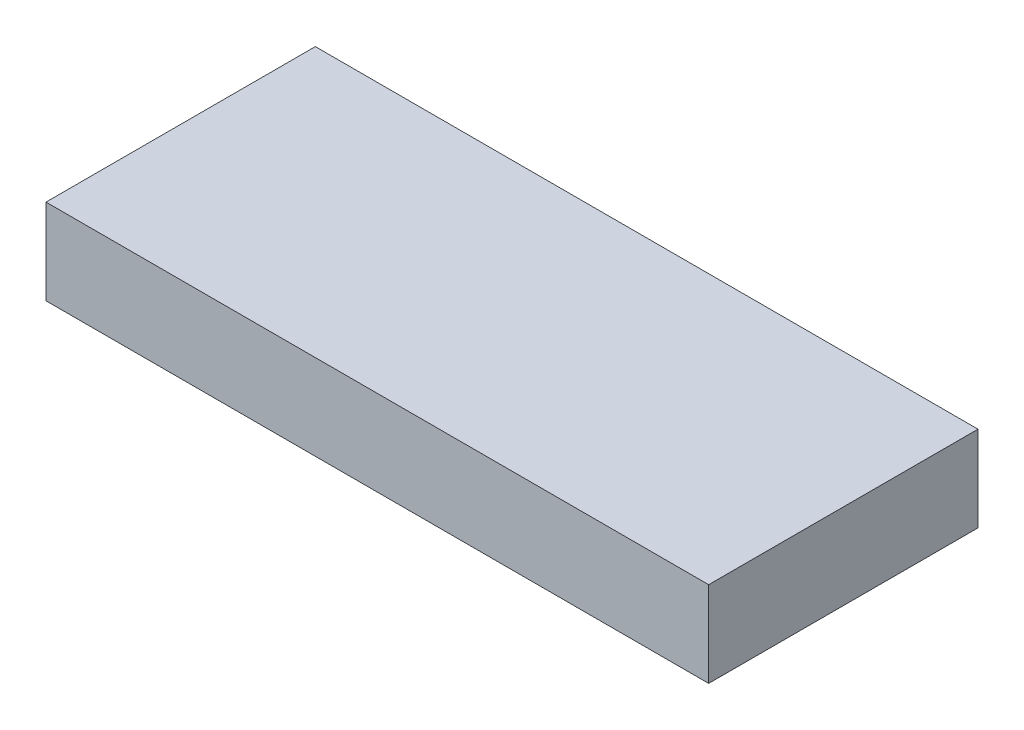
ISO-10303-21;
HEADER;
FILE_DESCRIPTION(('STEP AP214'),'2;1');
FILE_NAME('part.step','',(''),(''),'','','');
FILE_SCHEMA(('AUTOMOTIVE_DESIGN { 1 0 10303 214 1 1 1 1 }'));
ENDSEC;
DATA;
#1=APPLICATION_CONTEXT('core data for automotive mechanical design processes');
#2=APPLICATION_PROTOCOL_DEFINITION('international standard','automotive_design',2000,#1);
#3=PRODUCT_CONTEXT('',#1,'mechanical');
#4=PRODUCT('Part','Part','',(#3));
#5=PRODUCT_RELATED_PRODUCT_CATEGORY('part','',(#4));
#6=PRODUCT_DEFINITION_FORMATION('','',#4);
#7=PRODUCT_DEFINITION_CONTEXT('part definition',#1,'design');
#8=PRODUCT_DEFINITION('design','',#6,#7);
#9=PRODUCT_DEFINITION_SHAPE('','',#8);
#10=(LENGTH_UNIT() NAMED_UNIT(*) SI_UNIT(.MILLI.,.METRE.));
#11=(NAMED_UNIT(*) PLANE_ANGLE_UNIT() SI_UNIT($,.RADIAN.));
#12=(NAMED_UNIT(*) SI_UNIT($,.STERADIAN.) SOLID_ANGLE_UNIT());
#13=UNCERTAINTY_MEASURE_WITH_UNIT(LENGTH_MEASURE(1.E-05),#10,'distance_accuracy_value','');
#14=(GEOMETRIC_REPRESENTATION_CONTEXT(3) GLOBAL_UNCERTAINTY_ASSIGNED_CONTEXT((#13)) GLOBAL_UNIT_ASSIGNED_CONTEXT((#10,
#11,#12)) REPRESENTATION_CONTEXT('',''));
#15=CARTESIAN_POINT('',(0.,0.,0.));
#16=DIRECTION('',(0.,0.,1.));
#17=DIRECTION('',(1.,0.,0.));
#18=AXIS2_PLACEMENT_3D('',#15,#16,#17);
#19=CARTESIAN_POINT('',(-26.9514925373134,16.2518656716418,12.6));
#20=DIRECTION('',(1.,0.,0.));
#21=DIRECTION('',(0.,1.,0.));
#22=AXIS2_PLACEMENT_3D('',#19,#20,#21);
#23=PLANE('',#22);
#24=DIRECTION('',(0.,-1.,0.));
#25=VECTOR('',#24,1.);
#26=CARTESIAN_POINT('',(-26.9514925373134,16.2518656716418,0.));
#27=LINE('',#26,#25);
#28=CARTESIAN_POINT('',(-26.9514925373134,16.2518656716418,0.));
#29=VERTEX_POINT('',#28);
#30=CARTESIAN_POINT('',(-26.9514925373134,12.2518656716418,0.));
#31=VERTEX_POINT('',#30);
#32=EDGE_CURVE('E95',#29,#31,#27,.T.);
#33=ORIENTED_EDGE('',*,*,#32,.T.);
#34=DIRECTION('',(0.,0.,-1.));
#35=VECTOR('',#34,1.);
#36=CARTESIAN_POINT('',(-26.9514925373134,12.2518656716418,12.6));
#37=LINE('',#36,#35);
#38=CARTESIAN_POINT('',(-26.9514925373134,12.2518656716418,12.6));
#39=VERTEX_POINT('',#38);
#40=EDGE_CURVE('E11',#39,#31,#37,.T.);
#41=ORIENTED_EDGE('',*,*,#40,.F.);
#42=DIRECTION('',(0.,-1.,0.));
#43=VECTOR('',#42,1.);
#44=CARTESIAN_POINT('',(-26.9514925373134,16.2518656716418,12.6));
#45=LINE('',#44,#43);
#46=CARTESIAN_POINT('',(-26.9514925373134,16.2518656716418,12.6));
#47=VERTEX_POINT('',#46);
#48=EDGE_CURVE('E83',#47,#39,#45,.T.);
#49=ORIENTED_EDGE('',*,*,#48,.F.);
#50=DIRECTION('',(0.,0.,-1.));
#51=VECTOR('',#50,1.);
#52=CARTESIAN_POINT('',(-26.9514925373134,16.2518656716418,12.6));
#53=LINE('',#52,#51);
#54=EDGE_CURVE('E91',#47,#29,#53,.T.);
#55=ORIENTED_EDGE('',*,*,#54,.T.);
#56=EDGE_LOOP('',(#33,#41,#49,#55));
#57=FACE_BOUND('',#56,.T.);
#58=ADVANCED_FACE('F32',(#57),#23,.F.);
#59=CARTESIAN_POINT('',(-26.9514925373134,12.2518656716418,12.6));
#60=DIRECTION('',(0.,1.,0.));
#61=DIRECTION('',(0.,0.,1.));
#62=AXIS2_PLACEMENT_3D('',#59,#60,#61);
#63=PLANE('',#62);
#64=DIRECTION('',(1.,0.,0.));
#65=VECTOR('',#64,1.);
#66=CARTESIAN_POINT('',(-26.9514925373134,12.2518656716418,0.));
#67=LINE('',#66,#65);
#68=CARTESIAN_POINT('',(4.04850746268657,12.2518656716418,0.));
#69=VERTEX_POINT('',#68);
#70=EDGE_CURVE('E87',#31,#69,#67,.T.);
#71=ORIENTED_EDGE('',*,*,#70,.T.);
#72=DIRECTION('',(0.,0.,-1.));
#73=VECTOR('',#72,1.);
#74=CARTESIAN_POINT('',(4.04850746268657,12.2518656716418,12.6));
#75=LINE('',#74,#73);
#76=CARTESIAN_POINT('',(4.04850746268657,12.2518656716418,12.6));
#77=VERTEX_POINT('',#76);
#78=EDGE_CURVE('E40',#77,#69,#75,.T.);
#79=ORIENTED_EDGE('',*,*,#78,.F.);
#80=DIRECTION('',(1.,0.,0.));
#81=VECTOR('',#80,1.);
#82=CARTESIAN_POINT('',(-26.9514925373134,12.2518656716418,12.6));
#83=LINE('',#82,#81);
#84=EDGE_CURVE('E78',#39,#77,#83,.T.);
#85=ORIENTED_EDGE('',*,*,#84,.F.);
#86=ORIENTED_EDGE('',*,*,#40,.T.);
#87=EDGE_LOOP('',(#71,#79,#85,#86));
#88=FACE_BOUND('',#87,.T.);
#89=ADVANCED_FACE('F86',(#88),#63,.F.);
#90=CARTESIAN_POINT('',(4.04850746268657,16.2518656716418,12.6));
#91=DIRECTION('',(-1.,0.,0.));
#92=DIRECTION('',(0.,-1.,0.));
#93=AXIS2_PLACEMENT_3D('',#90,#91,#92);
#94=PLANE('',#93);
#95=DIRECTION('',(0.,1.,0.));
#96=VECTOR('',#95,1.);
#97=CARTESIAN_POINT('',(4.04850746268657,16.2518656716418,0.));
#98=LINE('',#97,#96);
#99=CARTESIAN_POINT('',(4.04850746268657,16.2518656716418,0.));
#100=VERTEX_POINT('',#99);
#101=EDGE_CURVE('E65',#69,#100,#98,.T.);
#102=ORIENTED_EDGE('',*,*,#101,.T.);
#103=DIRECTION('',(0.,0.,-1.));
#104=VECTOR('',#103,1.);
#105=CARTESIAN_POINT('',(4.04850746268657,16.2518656716418,12.6));
#106=LINE('',#105,#104);
#107=CARTESIAN_POINT('',(4.04850746268657,16.2518656716418,12.6));
#108=VERTEX_POINT('',#107);
#109=EDGE_CURVE('E88',#108,#100,#106,.T.);
#110=ORIENTED_EDGE('',*,*,#109,.F.);
#111=DIRECTION('',(0.,1.,0.));
#112=VECTOR('',#111,1.);
#113=CARTESIAN_POINT('',(4.04850746268657,16.2518656716418,12.6));
#114=LINE('',#113,#112);
#115=EDGE_CURVE('E81',#77,#108,#114,.T.);
#116=ORIENTED_EDGE('',*,*,#115,.F.);
#117=ORIENTED_EDGE('',*,*,#78,.T.);
#118=EDGE_LOOP('',(#102,#110,#116,#117));
#119=FACE_BOUND('',#118,.T.);
#120=ADVANCED_FACE('F89',(#119),#94,.F.);
#121=CARTESIAN_POINT('',(-26.9514925373134,16.2518656716418,12.6));
#122=DIRECTION('',(0.,-1.,0.));
#123=DIRECTION('',(0.,0.,-1.));
#124=AXIS2_PLACEMENT_3D('',#121,#122,#123);
#125=PLANE('',#124);
#126=DIRECTION('',(-1.,0.,0.));
#127=VECTOR('',#126,1.);
#128=CARTESIAN_POINT('',(-26.9514925373134,16.2518656716418,0.));
#129=LINE('',#128,#127);
#130=EDGE_CURVE('E71',#100,#29,#129,.T.);
#131=ORIENTED_EDGE('',*,*,#130,.T.);
#132=ORIENTED_EDGE('',*,*,#54,.F.);
#133=DIRECTION('',(-1.,0.,0.));
#134=VECTOR('',#133,1.);
#135=CARTESIAN_POINT('',(-26.9514925373134,16.2518656716418,12.6));
#136=LINE('',#135,#134);
#137=EDGE_CURVE('E48',#108,#47,#136,.T.);
#138=ORIENTED_EDGE('',*,*,#137,.F.);
#139=ORIENTED_EDGE('',*,*,#109,.T.);
#140=EDGE_LOOP('',(#131,#132,#138,#139));
#141=FACE_BOUND('',#140,.T.);
#142=ADVANCED_FACE('F102',(#141),#125,.F.);
#143=CARTESIAN_POINT('',(0.,0.,12.6));
#144=DIRECTION('',(0.,0.,1.));
#145=DIRECTION('',(1.,0.,0.));
#146=AXIS2_PLACEMENT_3D('',#143,#144,#145);
#147=PLANE('',#146);
#148=ORIENTED_EDGE('',*,*,#48,.T.);
#149=ORIENTED_EDGE('',*,*,#84,.T.);
#150=ORIENTED_EDGE('',*,*,#115,.T.);
#151=ORIENTED_EDGE('',*,*,#137,.T.);
#152=EDGE_LOOP('',(#148,#149,#150,#151));
#153=FACE_BOUND('',#152,.T.);
#154=ADVANCED_FACE('F79',(#153),#147,.T.);
#155=CARTESIAN_POINT('',(0.,0.,0.));
#156=DIRECTION('',(0.,0.,1.));
#157=DIRECTION('',(1.,0.,0.));
#158=AXIS2_PLACEMENT_3D('',#155,#156,#157);
#159=PLANE('',#158);
#160=ORIENTED_EDGE('',*,*,#32,.F.);
#161=ORIENTED_EDGE('',*,*,#130,.F.);
#162=ORIENTED_EDGE('',*,*,#101,.F.);
#163=ORIENTED_EDGE('',*,*,#70,.F.);
#164=EDGE_LOOP('',(#160,#161,#162,#163));
#165=FACE_BOUND('',#164,.T.);
#166=ADVANCED_FACE('F105',(#165),#159,.F.);
#167=CLOSED_SHELL('',(#58,#89,#120,#142,#154,#166));
#168=MANIFOLD_SOLID_BREP('B2',#167);
#169=ADVANCED_BREP_SHAPE_REPRESENTATION('',(#18,#168),#14);
#170=SHAPE_DEFINITION_REPRESENTATION(#9,#169);
ENDSEC;
END-ISO-10303-21;
